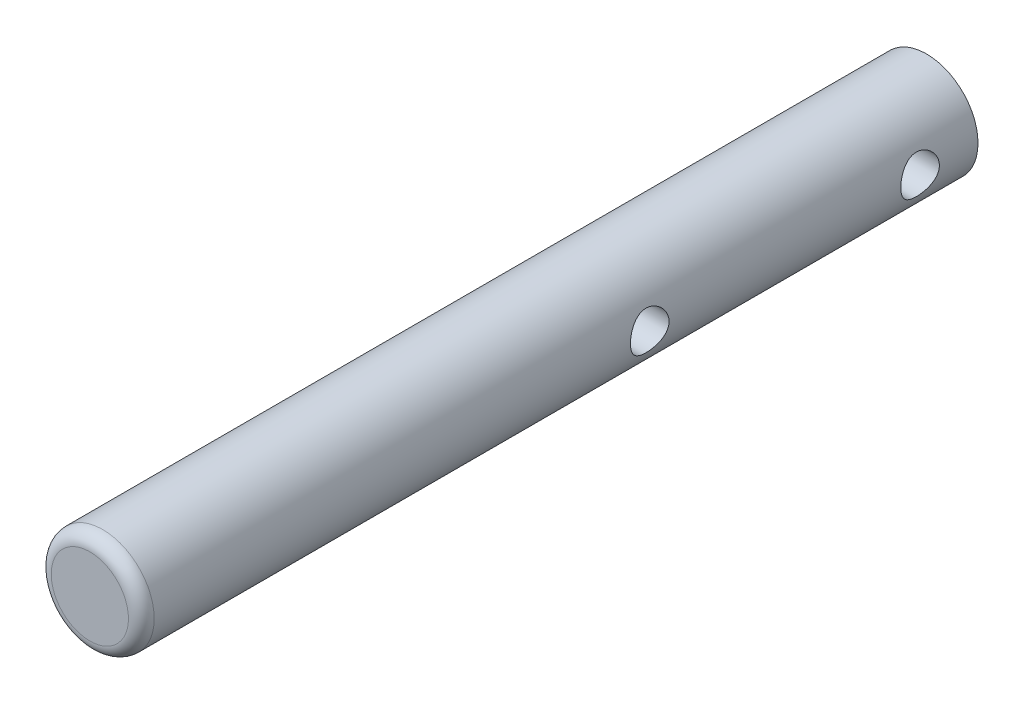
ISO-10303-21;
HEADER;
FILE_DESCRIPTION(('STEP AP214'),'2;1');
FILE_NAME('part.step','',(''),(''),'','','');
FILE_SCHEMA(('AUTOMOTIVE_DESIGN { 1 0 10303 214 1 1 1 1 }'));
ENDSEC;
DATA;
#1=APPLICATION_CONTEXT('core data for automotive mechanical design processes');
#2=APPLICATION_PROTOCOL_DEFINITION('international standard','automotive_design',2000,#1);
#3=PRODUCT_CONTEXT('',#1,'mechanical');
#4=PRODUCT('Part','Part','',(#3));
#5=PRODUCT_RELATED_PRODUCT_CATEGORY('part','',(#4));
#6=PRODUCT_DEFINITION_FORMATION('','',#4);
#7=PRODUCT_DEFINITION_CONTEXT('part definition',#1,'design');
#8=PRODUCT_DEFINITION('design','',#6,#7);
#9=PRODUCT_DEFINITION_SHAPE('','',#8);
#10=(LENGTH_UNIT() NAMED_UNIT(*) SI_UNIT(.MILLI.,.METRE.));
#11=(NAMED_UNIT(*) PLANE_ANGLE_UNIT() SI_UNIT($,.RADIAN.));
#12=(NAMED_UNIT(*) SI_UNIT($,.STERADIAN.) SOLID_ANGLE_UNIT());
#13=UNCERTAINTY_MEASURE_WITH_UNIT(LENGTH_MEASURE(1.E-05),#10,'distance_accuracy_value','');
#14=(GEOMETRIC_REPRESENTATION_CONTEXT(3) GLOBAL_UNCERTAINTY_ASSIGNED_CONTEXT((#13)) GLOBAL_UNIT_ASSIGNED_CONTEXT((#10,
#11,#12)) REPRESENTATION_CONTEXT('',''));
#15=CARTESIAN_POINT('',(0.,0.,0.));
#16=DIRECTION('',(0.,0.,1.));
#17=DIRECTION('',(1.,0.,0.));
#18=AXIS2_PLACEMENT_3D('',#15,#16,#17);
#19=CARTESIAN_POINT('',(0.,0.,65.));
#20=DIRECTION('',(0.,0.,-1.));
#21=DIRECTION('',(-1.,0.,0.));
#22=AXIS2_PLACEMENT_3D('',#19,#20,#21);
#23=CYLINDRICAL_SURFACE('',#22,4.);
#24=CARTESIAN_POINT('',(0.,0.,64.));
#25=DIRECTION('',(0.,0.,1.));
#26=DIRECTION('',(1.,0.,0.));
#27=AXIS2_PLACEMENT_3D('',#24,#25,#26);
#28=CIRCLE('',#27,4.);
#29=CARTESIAN_POINT('',(4.,0.,64.));
#30=VERTEX_POINT('',#29);
#31=EDGE_CURVE('E10',#30,#30,#28,.F.);
#32=ORIENTED_EDGE('',*,*,#31,.T.);
#33=EDGE_LOOP('',(#32));
#34=FACE_BOUND('',#33,.T.);
#35=CARTESIAN_POINT('',(-4.,0.,6.));
#36=CARTESIAN_POINT('',(-4.00000217456151,-0.0812350589378527,6.00000290230312));
#37=CARTESIAN_POINT('',(-3.99750379283184,-0.162450241781792,5.99338023975162));
#38=CARTESIAN_POINT('',(-3.98778696006928,-0.322453452352361,5.96717180473007));
#39=CARTESIAN_POINT('',(-3.98056918893993,-0.401241827987616,5.94758789952943));
#40=CARTESIAN_POINT('',(-3.96218832391545,-0.554060784990879,5.89624699822824));
#41=CARTESIAN_POINT('',(-3.9510328434944,-0.628100224162278,5.86451348317821));
#42=CARTESIAN_POINT('',(-3.92588767765353,-0.769799310160254,5.78989358698418));
#43=CARTESIAN_POINT('',(-3.91189723227548,-0.83745723917788,5.74700421445584));
#44=CARTESIAN_POINT('',(-3.88186246971217,-0.967346417045826,5.64938746892909));
#45=CARTESIAN_POINT('',(-3.86576002583566,-1.02927073015119,5.5942697377406));
#46=CARTESIAN_POINT('',(-3.83360220871327,-1.14324421474363,5.47458956534116));
#47=CARTESIAN_POINT('',(-3.81754685135033,-1.19529036359203,5.41002424391213));
#48=CARTESIAN_POINT('',(-3.78662470617731,-1.28998202215985,5.27028253247679));
#49=CARTESIAN_POINT('',(-3.77182648820818,-1.3321939319576,5.19479563345418));
#50=CARTESIAN_POINT('',(-3.74599860237433,-1.40318646334084,5.03715164583148));
#51=CARTESIAN_POINT('',(-3.73496742975881,-1.43197244961239,4.9549972368449));
#52=CARTESIAN_POINT('',(-3.71854412824136,-1.47408431017549,4.7898832597418));
#53=CARTESIAN_POINT('',(-3.71293924350838,-1.48799593218558,4.70709496156456));
#54=CARTESIAN_POINT('',(-3.70738061461215,-1.50179556531648,4.54018384200616));
#55=CARTESIAN_POINT('',(-3.70742453659305,-1.50168936802631,4.45606158612553));
#56=CARTESIAN_POINT('',(-3.71297511632055,-1.48790429610018,4.29423047478704));
#57=CARTESIAN_POINT('',(-3.71815468871122,-1.47503808509003,4.21643909395582));
#58=CARTESIAN_POINT('',(-3.73284938059529,-1.4374416786833,4.06421284959468));
#59=CARTESIAN_POINT('',(-3.74236515298863,-1.41270969663258,3.98977849338612));
#60=CARTESIAN_POINT('',(-3.76485702190253,-1.35163748571904,3.84472293227177));
#61=CARTESIAN_POINT('',(-3.77789517988166,-1.31508648737101,3.7742005138787));
#62=CARTESIAN_POINT('',(-3.80594210139319,-1.23156073762698,3.64005426240903));
#63=CARTESIAN_POINT('',(-3.82095154457158,-1.18458238728897,3.5764328224803));
#64=CARTESIAN_POINT('',(-3.85248038859113,-1.07781780766549,3.45339633634912));
#65=CARTESIAN_POINT('',(-3.86903347455671,-1.01738298716955,3.39455135925191));
#66=CARTESIAN_POINT('',(-3.90091728164085,-0.88731259081902,3.2876620337942));
#67=CARTESIAN_POINT('',(-3.91624781465952,-0.817675603497363,3.23961934539433));
#68=CARTESIAN_POINT('',(-3.9442639480908,-0.669723436992419,3.15506960293748));
#69=CARTESIAN_POINT('',(-3.95690498259616,-0.591290713844718,3.11875241877894));
#70=CARTESIAN_POINT('',(-3.97778718326962,-0.428836850524582,3.06001739572996));
#71=CARTESIAN_POINT('',(-3.98603030341493,-0.344818210845767,3.03759338343888));
#72=CARTESIAN_POINT('',(-3.99684443228065,-0.178375243148665,3.00837721245806));
#73=CARTESIAN_POINT('',(-3.99969369025686,-0.096103619562209,3.00081739361749));
#74=CARTESIAN_POINT('',(-4.00025893700126,0.0685724752550247,2.99930893610008));
#75=CARTESIAN_POINT('',(-3.99797606386863,0.150976912983373,3.00535727968322));
#76=CARTESIAN_POINT('',(-3.98871709772643,0.31026204856186,3.03031004230867));
#77=CARTESIAN_POINT('',(-3.98192470962305,0.387233328007336,3.04871154373709));
#78=CARTESIAN_POINT('',(-3.96451477091717,0.536941754957221,3.09718607254732));
#79=CARTESIAN_POINT('',(-3.9538967228203,0.609678350347535,3.12726061794804));
#80=CARTESIAN_POINT('',(-3.92949624407681,0.751247765110156,3.19918641243948));
#81=CARTESIAN_POINT('',(-3.91563000209348,0.819903083557796,3.24135772922339));
#82=CARTESIAN_POINT('',(-3.88626671564664,0.949392711726626,3.33591810317156));
#83=CARTESIAN_POINT('',(-3.87076907009516,1.01022412027045,3.38831093254515));
#84=CARTESIAN_POINT('',(-3.8387332949099,1.12603079874454,3.50540412212428));
#85=CARTESIAN_POINT('',(-3.82218696503729,1.18046154123569,3.5706421827727));
#86=CARTESIAN_POINT('',(-3.79078815746854,1.27771050031903,3.70965138470766));
#87=CARTESIAN_POINT('',(-3.77593583194399,1.32052767414518,3.7834232913885));
#88=CARTESIAN_POINT('',(-3.74966829822463,1.39337773518998,3.93801598677231));
#89=CARTESIAN_POINT('',(-3.73826760328493,1.42335685446918,4.01886474591044));
#90=CARTESIAN_POINT('',(-3.72054032891005,1.46907883466889,4.18500976368782));
#91=CARTESIAN_POINT('',(-3.71421061057491,1.48483050305535,4.27030323619812));
#92=CARTESIAN_POINT('',(-3.70775894792573,1.50086347097839,4.43701615954112));
#93=CARTESIAN_POINT('',(-3.70726444523341,1.50207331495837,4.51833263171689));
#94=CARTESIAN_POINT('',(-3.71158412745292,1.49136715641593,4.67994531627617));
#95=CARTESIAN_POINT('',(-3.71639780898899,1.47945239850124,4.76024162467158));
#96=CARTESIAN_POINT('',(-3.73048141585432,1.44355815630242,4.91504722671655));
#97=CARTESIAN_POINT('',(-3.73961085376663,1.41995798316524,4.98965834624535));
#98=CARTESIAN_POINT('',(-3.76121548297845,1.3616969677992,5.13390550849442));
#99=CARTESIAN_POINT('',(-3.77369151995215,1.32703332944945,5.20354028807014));
#100=CARTESIAN_POINT('',(-3.80139723903965,1.24552075938154,5.33982678969763));
#101=CARTESIAN_POINT('',(-3.81673698440964,1.1981283280301,5.40613079679991));
#102=CARTESIAN_POINT('',(-3.84806246757177,1.09334485729906,5.53014156097121));
#103=CARTESIAN_POINT('',(-3.86404840943145,1.03595064012808,5.58784557478675));
#104=CARTESIAN_POINT('',(-3.89590424609881,0.909080396784622,5.69620195582184));
#105=CARTESIAN_POINT('',(-3.91172104900645,0.839118644212991,5.74630375343467));
#106=CARTESIAN_POINT('',(-3.94054514457031,0.69121322320082,5.83402265527656));
#107=CARTESIAN_POINT('',(-3.95355221851559,0.613268934090621,5.87163878773637));
#108=CARTESIAN_POINT('',(-3.9757429260668,0.447999082002311,5.93437682904833));
#109=CARTESIAN_POINT('',(-3.98473657158356,0.360413422234208,5.9588870646019));
#110=CARTESIAN_POINT('',(-3.99686242179587,0.181875733606381,5.99169295992068));
#111=CARTESIAN_POINT('',(-3.99999756603967,0.0909254163648586,5.99999675148733));
#112=CARTESIAN_POINT('',(-4.,0.,6.));
#113=B_SPLINE_CURVE_WITH_KNOTS('',3,(#35,#36,#37,#38,#39,#40,#41,#42,#43,#44,#45,#46,#47,#48,
#49,#50,#51,#52,#53,#54,#55,#56,#57,#58,#59,#60,#61,#62,#63,#64,#65,#66,#67,#68,#69,#70,#71,#72,
#73,#74,#75,#76,#77,#78,#79,#80,#81,#82,#83,#84,#85,#86,#87,#88,#89,#90,#91,#92,#93,#94,#95,#96,
#97,#98,#99,#100,#101,#102,#103,#104,#105,#106,#107,#108,#109,#110,#111,#112),.UNSPECIFIED.,.T.,
.F.,(4,2,2,2,2,2,2,2,2,2,2,2,2,2,2,2,2,2,2,2,2,2,2,2,2,2,2,2,2,2,2,2,2,2,2,2,2,2,4),(0.,
0.24336980156056,0.486704549530461,0.729571369213574,0.97250337960949,1.22473618582715,
1.47704604925622,1.73896674501659,2.00078269352134,2.25185874416902,2.50283106079707,
2.73878345119971,2.97477138060589,3.21522408387018,3.45575990744259,3.71246153335813,
3.96920257905066,4.22991375286075,4.49050899698846,4.73725019635925,4.98393668390521,
5.2211443792384,5.45838293254454,5.702592218596,5.94689180019868,6.20536519455658,
6.46386178920141,6.72343066727204,6.98283874956507,7.22558763480252,7.46831350211259,
7.70363142426533,7.93900886656507,8.18672471884271,8.43451941997062,8.69572329654039,
8.95694749805102,9.22948515032042,9.50188601796127),.UNSPECIFIED.);
#114=CARTESIAN_POINT('',(-4.,0.,6.));
#115=VERTEX_POINT('',#114);
#116=EDGE_CURVE('E49',#115,#115,#113,.T.);
#117=ORIENTED_EDGE('',*,*,#116,.T.);
#118=EDGE_LOOP('',(#117));
#119=FACE_BOUND('',#118,.T.);
#120=CARTESIAN_POINT('',(4.,0.,3.));
#121=CARTESIAN_POINT('',(4.00000217456151,-0.0812350589378529,2.99999709769689));
#122=CARTESIAN_POINT('',(3.99750379283184,-0.162450241781792,3.00661976024838));
#123=CARTESIAN_POINT('',(3.98778696006928,-0.322453452352361,3.03282819526993));
#124=CARTESIAN_POINT('',(3.98056918893993,-0.401241827987616,3.05241210047057));
#125=CARTESIAN_POINT('',(3.96218832391545,-0.554060784990879,3.10375300177176));
#126=CARTESIAN_POINT('',(3.9510328434944,-0.628100224162278,3.13548651682179));
#127=CARTESIAN_POINT('',(3.92588767765353,-0.769799310160254,3.21010641301582));
#128=CARTESIAN_POINT('',(3.91189723227548,-0.837457239177879,3.25299578554416));
#129=CARTESIAN_POINT('',(3.88186246971217,-0.967346417045826,3.35061253107091));
#130=CARTESIAN_POINT('',(3.86576002583566,-1.02927073015119,3.4057302622594));
#131=CARTESIAN_POINT('',(3.83360220871327,-1.14324421474363,3.52541043465884));
#132=CARTESIAN_POINT('',(3.81754685135033,-1.19529036359203,3.58997575608788));
#133=CARTESIAN_POINT('',(3.78662470617731,-1.28998202215985,3.72971746752321));
#134=CARTESIAN_POINT('',(3.77182648820818,-1.3321939319576,3.80520436654582));
#135=CARTESIAN_POINT('',(3.74599860237433,-1.40318646334084,3.96284835416852));
#136=CARTESIAN_POINT('',(3.73496742975881,-1.43197244961239,4.0450027631551));
#137=CARTESIAN_POINT('',(3.71854412824136,-1.47408431017549,4.2101167402582));
#138=CARTESIAN_POINT('',(3.71293924350838,-1.48799593218558,4.29290503843544));
#139=CARTESIAN_POINT('',(3.70738061461215,-1.50179556531648,4.45981615799384));
#140=CARTESIAN_POINT('',(3.70742453659305,-1.5016893680263,4.54393841387447));
#141=CARTESIAN_POINT('',(3.71297511632055,-1.48790429610018,4.70576952521296));
#142=CARTESIAN_POINT('',(3.71815468871122,-1.47503808509003,4.78356090604418));
#143=CARTESIAN_POINT('',(3.73284938059529,-1.4374416786833,4.93578715040532));
#144=CARTESIAN_POINT('',(3.74236515298863,-1.41270969663258,5.01022150661388));
#145=CARTESIAN_POINT('',(3.76485702190253,-1.35163748571904,5.15527706772823));
#146=CARTESIAN_POINT('',(3.77789517988166,-1.31508648737101,5.2257994861213));
#147=CARTESIAN_POINT('',(3.80594210139319,-1.23156073762698,5.35994573759097));
#148=CARTESIAN_POINT('',(3.82095154457158,-1.18458238728897,5.4235671775197));
#149=CARTESIAN_POINT('',(3.85248038859113,-1.07781780766549,5.54660366365088));
#150=CARTESIAN_POINT('',(3.86903347455671,-1.01738298716955,5.60544864074809));
#151=CARTESIAN_POINT('',(3.90091728164085,-0.88731259081902,5.7123379662058));
#152=CARTESIAN_POINT('',(3.91624781465952,-0.817675603497363,5.76038065460567));
#153=CARTESIAN_POINT('',(3.9442639480908,-0.669723436992419,5.84493039706252));
#154=CARTESIAN_POINT('',(3.95690498259616,-0.591290713844718,5.88124758122106));
#155=CARTESIAN_POINT('',(3.97778718326962,-0.428836850524583,5.93998260427004));
#156=CARTESIAN_POINT('',(3.98603030341493,-0.344818210845767,5.96240661656112));
#157=CARTESIAN_POINT('',(3.99684443228065,-0.178375243148665,5.99162278754194));
#158=CARTESIAN_POINT('',(3.99969369025686,-0.0961036195622095,5.99918260638251));
#159=CARTESIAN_POINT('',(4.00025893700126,0.0685724752550242,6.00069106389992));
#160=CARTESIAN_POINT('',(3.99797606386863,0.150976912983373,5.99464272031678));
#161=CARTESIAN_POINT('',(3.98871709772643,0.310262048561859,5.96968995769133));
#162=CARTESIAN_POINT('',(3.98192470962305,0.387233328007336,5.95128845626292));
#163=CARTESIAN_POINT('',(3.96451477091717,0.536941754957221,5.90281392745268));
#164=CARTESIAN_POINT('',(3.9538967228203,0.609678350347534,5.87273938205196));
#165=CARTESIAN_POINT('',(3.92949624407681,0.751247765110155,5.80081358756052));
#166=CARTESIAN_POINT('',(3.91563000209348,0.819903083557795,5.75864227077661));
#167=CARTESIAN_POINT('',(3.88626671564664,0.949392711726625,5.66408189682844));
#168=CARTESIAN_POINT('',(3.87076907009516,1.01022412027045,5.61168906745485));
#169=CARTESIAN_POINT('',(3.8387332949099,1.12603079874454,5.49459587787573));
#170=CARTESIAN_POINT('',(3.82218696503729,1.18046154123568,5.4293578172273));
#171=CARTESIAN_POINT('',(3.79078815746854,1.27771050031903,5.29034861529234));
#172=CARTESIAN_POINT('',(3.77593583194399,1.32052767414518,5.2165767086115));
#173=CARTESIAN_POINT('',(3.74966829822463,1.39337773518998,5.06198401322769));
#174=CARTESIAN_POINT('',(3.73826760328493,1.42335685446918,4.98113525408956));
#175=CARTESIAN_POINT('',(3.72054032891005,1.46907883466889,4.81499023631218));
#176=CARTESIAN_POINT('',(3.71421061057491,1.48483050305535,4.72969676380188));
#177=CARTESIAN_POINT('',(3.70775894792573,1.50086347097839,4.56298384045889));
#178=CARTESIAN_POINT('',(3.70726444523341,1.50207331495837,4.48166736828311));
#179=CARTESIAN_POINT('',(3.71158412745292,1.49136715641593,4.32005468372384));
#180=CARTESIAN_POINT('',(3.71639780898899,1.47945239850124,4.23975837532842));
#181=CARTESIAN_POINT('',(3.73048141585432,1.44355815630242,4.08495277328345));
#182=CARTESIAN_POINT('',(3.73961085376663,1.41995798316524,4.01034165375466));
#183=CARTESIAN_POINT('',(3.76121548297845,1.3616969677992,3.86609449150558));
#184=CARTESIAN_POINT('',(3.77369151995215,1.32703332944945,3.79645971192986));
#185=CARTESIAN_POINT('',(3.80139723903965,1.24552075938154,3.66017321030237));
#186=CARTESIAN_POINT('',(3.81673698440964,1.1981283280301,3.59386920320009));
#187=CARTESIAN_POINT('',(3.84806246757177,1.09334485729906,3.4698584390288));
#188=CARTESIAN_POINT('',(3.86404840943145,1.03595064012808,3.41215442521325));
#189=CARTESIAN_POINT('',(3.89590424609881,0.909080396784623,3.30379804417816));
#190=CARTESIAN_POINT('',(3.91172104900645,0.839118644212992,3.25369624656533));
#191=CARTESIAN_POINT('',(3.94054514457031,0.691213223200821,3.16597734472344));
#192=CARTESIAN_POINT('',(3.95355221851559,0.613268934090621,3.12836121226363));
#193=CARTESIAN_POINT('',(3.9757429260668,0.447999082002312,3.06562317095167));
#194=CARTESIAN_POINT('',(3.98473657158356,0.360413422234208,3.0411129353981));
#195=CARTESIAN_POINT('',(3.99686242179587,0.181875733606382,3.00830704007932));
#196=CARTESIAN_POINT('',(3.99999756603967,0.0909254163648589,3.00000324851268));
#197=CARTESIAN_POINT('',(4.,0.,3.));
#198=B_SPLINE_CURVE_WITH_KNOTS('',3,(#120,#121,#122,#123,#124,#125,#126,#127,#128,#129,#130,
#131,#132,#133,#134,#135,#136,#137,#138,#139,#140,#141,#142,#143,#144,#145,#146,#147,#148,#149,
#150,#151,#152,#153,#154,#155,#156,#157,#158,#159,#160,#161,#162,#163,#164,#165,#166,#167,#168,
#169,#170,#171,#172,#173,#174,#175,#176,#177,#178,#179,#180,#181,#182,#183,#184,#185,#186,#187,
#188,#189,#190,#191,#192,#193,#194,#195,#196,#197),.UNSPECIFIED.,.T.,.F.,(4,2,2,2,2,2,2,2,2,2,2,
2,2,2,2,2,2,2,2,2,2,2,2,2,2,2,2,2,2,2,2,2,2,2,2,2,2,2,4),(0.,0.24336980156056,0.486704549530461,
0.729571369213573,0.97250337960949,1.22473618582715,1.47704604925622,1.73896674501659,
2.00078269352134,2.25185874416902,2.50283106079707,2.73878345119971,2.97477138060589,
3.21522408387018,3.45575990744258,3.71246153335813,3.96920257905066,4.22991375286075,
4.49050899698846,4.73725019635925,4.98393668390521,5.2211443792384,5.45838293254453,
5.702592218596,5.94689180019868,6.20536519455658,6.46386178920141,6.72343066727204,
6.98283874956507,7.22558763480252,7.46831350211259,7.70363142426533,7.93900886656506,
8.18672471884271,8.43451941997062,8.69572329654039,8.95694749805102,9.22948515032042,
9.50188601796128),.UNSPECIFIED.);
#199=CARTESIAN_POINT('',(4.,0.,3.));
#200=VERTEX_POINT('',#199);
#201=EDGE_CURVE('E56',#200,#200,#198,.T.);
#202=ORIENTED_EDGE('',*,*,#201,.T.);
#203=EDGE_LOOP('',(#202));
#204=FACE_BOUND('',#203,.T.);
#205=CARTESIAN_POINT('',(-4.,0.,27.));
#206=CARTESIAN_POINT('',(-4.00000217456151,-0.0812350589378528,27.0000029023031));
#207=CARTESIAN_POINT('',(-3.99750379283184,-0.162450241781792,26.9933802397516));
#208=CARTESIAN_POINT('',(-3.98778696006928,-0.322453452352361,26.9671718047301));
#209=CARTESIAN_POINT('',(-3.98056918893993,-0.401241827987616,26.9475878995294));
#210=CARTESIAN_POINT('',(-3.96218832391545,-0.554060784990879,26.8962469982282));
#211=CARTESIAN_POINT('',(-3.9510328434944,-0.628100224162278,26.8645134831782));
#212=CARTESIAN_POINT('',(-3.92588767765353,-0.769799310160255,26.7898935869842));
#213=CARTESIAN_POINT('',(-3.91189723227548,-0.83745723917788,26.7470042144558));
#214=CARTESIAN_POINT('',(-3.88186246971217,-0.967346417045826,26.6493874689291));
#215=CARTESIAN_POINT('',(-3.86576002583566,-1.02927073015119,26.5942697377406));
#216=CARTESIAN_POINT('',(-3.83360220871327,-1.14324421474363,26.4745895653412));
#217=CARTESIAN_POINT('',(-3.81754685135033,-1.19529036359203,26.4100242439121));
#218=CARTESIAN_POINT('',(-3.78662470617731,-1.28998202215985,26.2702825324768));
#219=CARTESIAN_POINT('',(-3.77182648820818,-1.3321939319576,26.1947956334542));
#220=CARTESIAN_POINT('',(-3.74599860237433,-1.40318646334085,26.0371516458315));
#221=CARTESIAN_POINT('',(-3.73496742975881,-1.43197244961239,25.9549972368449));
#222=CARTESIAN_POINT('',(-3.71854412824136,-1.47408431017549,25.7898832597418));
#223=CARTESIAN_POINT('',(-3.71293924350838,-1.48799593218558,25.7070949615646));
#224=CARTESIAN_POINT('',(-3.70738061461215,-1.50179556531648,25.5401838420062));
#225=CARTESIAN_POINT('',(-3.70742453659305,-1.50168936802631,25.4560615861255));
#226=CARTESIAN_POINT('',(-3.71297511632055,-1.48790429610018,25.294230474787));
#227=CARTESIAN_POINT('',(-3.71815468871121,-1.47503808509003,25.2164390939558));
#228=CARTESIAN_POINT('',(-3.73284938059529,-1.4374416786833,25.0642128495947));
#229=CARTESIAN_POINT('',(-3.74236515298863,-1.41270969663258,24.9897784933861));
#230=CARTESIAN_POINT('',(-3.76485702190253,-1.35163748571904,24.8447229322718));
#231=CARTESIAN_POINT('',(-3.77789517988166,-1.31508648737101,24.7742005138787));
#232=CARTESIAN_POINT('',(-3.80594210139319,-1.23156073762698,24.640054262409));
#233=CARTESIAN_POINT('',(-3.82095154457158,-1.18458238728897,24.5764328224803));
#234=CARTESIAN_POINT('',(-3.85248038859113,-1.07781780766549,24.4533963363491));
#235=CARTESIAN_POINT('',(-3.86903347455671,-1.01738298716956,24.3945513592519));
#236=CARTESIAN_POINT('',(-3.90091728164085,-0.887312590819022,24.2876620337942));
#237=CARTESIAN_POINT('',(-3.91624781465952,-0.817675603497365,24.2396193453943));
#238=CARTESIAN_POINT('',(-3.9442639480908,-0.66972343699242,24.1550696029375));
#239=CARTESIAN_POINT('',(-3.95690498259616,-0.591290713844719,24.1187524187789));
#240=CARTESIAN_POINT('',(-3.97778718326962,-0.428836850524583,24.06001739573));
#241=CARTESIAN_POINT('',(-3.98603030341493,-0.344818210845767,24.0375933834389));
#242=CARTESIAN_POINT('',(-3.99684443228065,-0.178375243148666,24.0083772124581));
#243=CARTESIAN_POINT('',(-3.99969369025686,-0.0961036195622097,24.0008173936175));
#244=CARTESIAN_POINT('',(-4.00025893700126,0.0685724752550241,23.9993089361001));
#245=CARTESIAN_POINT('',(-3.99797606386863,0.150976912983373,24.0053572796832));
#246=CARTESIAN_POINT('',(-3.98871709772643,0.310262048561859,24.0303100423087));
#247=CARTESIAN_POINT('',(-3.98192470962305,0.387233328007336,24.0487115437371));
#248=CARTESIAN_POINT('',(-3.96451477091717,0.53694175495722,24.0971860725473));
#249=CARTESIAN_POINT('',(-3.9538967228203,0.609678350347534,24.127260617948));
#250=CARTESIAN_POINT('',(-3.92949624407681,0.751247765110155,24.1991864124395));
#251=CARTESIAN_POINT('',(-3.91563000209348,0.819903083557796,24.2413577292234));
#252=CARTESIAN_POINT('',(-3.88626671564664,0.949392711726626,24.3359181031716));
#253=CARTESIAN_POINT('',(-3.87076907009516,1.01022412027045,24.3883109325452));
#254=CARTESIAN_POINT('',(-3.83873329490989,1.12603079874454,24.5054041221243));
#255=CARTESIAN_POINT('',(-3.82218696503729,1.18046154123569,24.5706421827727));
#256=CARTESIAN_POINT('',(-3.79078815746853,1.27771050031904,24.7096513847077));
#257=CARTESIAN_POINT('',(-3.77593583194399,1.32052767414519,24.7834232913885));
#258=CARTESIAN_POINT('',(-3.74966829822463,1.39337773518998,24.9380159867723));
#259=CARTESIAN_POINT('',(-3.73826760328493,1.42335685446918,25.0188647459104));
#260=CARTESIAN_POINT('',(-3.72054032891005,1.46907883466889,25.1850097636878));
#261=CARTESIAN_POINT('',(-3.71421061057491,1.48483050305535,25.2703032361981));
#262=CARTESIAN_POINT('',(-3.70775894792573,1.50086347097839,25.4370161595411));
#263=CARTESIAN_POINT('',(-3.70726444523341,1.50207331495837,25.5183326317169));
#264=CARTESIAN_POINT('',(-3.71158412745292,1.49136715641593,25.6799453162762));
#265=CARTESIAN_POINT('',(-3.71639780898899,1.47945239850124,25.7602416246716));
#266=CARTESIAN_POINT('',(-3.73048141585432,1.44355815630242,25.9150472267166));
#267=CARTESIAN_POINT('',(-3.73961085376663,1.41995798316524,25.9896583462453));
#268=CARTESIAN_POINT('',(-3.76121548297845,1.3616969677992,26.1339055084944));
#269=CARTESIAN_POINT('',(-3.77369151995215,1.32703332944945,26.2035402880701));
#270=CARTESIAN_POINT('',(-3.80139723903965,1.24552075938154,26.3398267896976));
#271=CARTESIAN_POINT('',(-3.81673698440964,1.1981283280301,26.4061307967999));
#272=CARTESIAN_POINT('',(-3.84806246757177,1.09334485729906,26.5301415609712));
#273=CARTESIAN_POINT('',(-3.86404840943145,1.03595064012808,26.5878455747868));
#274=CARTESIAN_POINT('',(-3.89590424609881,0.909080396784624,26.6962019558218));
#275=CARTESIAN_POINT('',(-3.91172104900645,0.839118644212993,26.7463037534347));
#276=CARTESIAN_POINT('',(-3.9405451445703,0.691213223200822,26.8340226552766));
#277=CARTESIAN_POINT('',(-3.95355221851559,0.613268934090623,26.8716387877364));
#278=CARTESIAN_POINT('',(-3.9757429260668,0.447999082002313,26.9343768290483));
#279=CARTESIAN_POINT('',(-3.98473657158356,0.360413422234208,26.9588870646019));
#280=CARTESIAN_POINT('',(-3.99686242179587,0.181875733606382,26.9916929599207));
#281=CARTESIAN_POINT('',(-3.99999756603967,0.0909254163648587,26.9999967514873));
#282=CARTESIAN_POINT('',(-4.,0.,27.));
#283=B_SPLINE_CURVE_WITH_KNOTS('',3,(#205,#206,#207,#208,#209,#210,#211,#212,#213,#214,#215,
#216,#217,#218,#219,#220,#221,#222,#223,#224,#225,#226,#227,#228,#229,#230,#231,#232,#233,#234,
#235,#236,#237,#238,#239,#240,#241,#242,#243,#244,#245,#246,#247,#248,#249,#250,#251,#252,#253,
#254,#255,#256,#257,#258,#259,#260,#261,#262,#263,#264,#265,#266,#267,#268,#269,#270,#271,#272,
#273,#274,#275,#276,#277,#278,#279,#280,#281,#282),.UNSPECIFIED.,.T.,.F.,(4,2,2,2,2,2,2,2,2,2,2,
2,2,2,2,2,2,2,2,2,2,2,2,2,2,2,2,2,2,2,2,2,2,2,2,2,2,2,4),(0.,0.24336980156056,0.48670454953046,
0.729571369213573,0.972503379609492,1.22473618582716,1.47704604925622,1.73896674501659,
2.00078269352134,2.25185874416902,2.50283106079707,2.73878345119972,2.97477138060589,
3.21522408387018,3.45575990744259,3.71246153335813,3.96920257905066,4.22991375286075,
4.49050899698846,4.73725019635926,4.98393668390521,5.2211443792384,5.45838293254454,
5.702592218596,5.94689180019868,6.20536519455659,6.46386178920141,6.72343066727205,
6.98283874956507,7.22558763480252,7.46831350211259,7.70363142426534,7.93900886656507,
8.18672471884271,8.43451941997062,8.69572329654039,8.95694749805102,9.22948515032042,
9.50188601796128),.UNSPECIFIED.);
#284=CARTESIAN_POINT('',(-4.,0.,27.));
#285=VERTEX_POINT('',#284);
#286=EDGE_CURVE('E46',#285,#285,#283,.T.);
#287=ORIENTED_EDGE('',*,*,#286,.T.);
#288=EDGE_LOOP('',(#287));
#289=FACE_BOUND('',#288,.T.);
#290=CARTESIAN_POINT('',(4.,0.,24.));
#291=CARTESIAN_POINT('',(4.00000217456151,-0.0812350589378528,23.9999970976969));
#292=CARTESIAN_POINT('',(3.99750379283184,-0.162450241781792,24.0066197602484));
#293=CARTESIAN_POINT('',(3.98778696006928,-0.322453452352361,24.0328281952699));
#294=CARTESIAN_POINT('',(3.98056918893993,-0.401241827987616,24.0524121004706));
#295=CARTESIAN_POINT('',(3.96218832391545,-0.554060784990879,24.1037530017718));
#296=CARTESIAN_POINT('',(3.9510328434944,-0.628100224162278,24.1354865168218));
#297=CARTESIAN_POINT('',(3.92588767765353,-0.769799310160255,24.2101064130158));
#298=CARTESIAN_POINT('',(3.91189723227548,-0.83745723917788,24.2529957855442));
#299=CARTESIAN_POINT('',(3.88186246971217,-0.967346417045826,24.3506125310709));
#300=CARTESIAN_POINT('',(3.86576002583566,-1.02927073015119,24.4057302622594));
#301=CARTESIAN_POINT('',(3.83360220871327,-1.14324421474363,24.5254104346588));
#302=CARTESIAN_POINT('',(3.81754685135033,-1.19529036359203,24.5899757560879));
#303=CARTESIAN_POINT('',(3.78662470617731,-1.28998202215985,24.7297174675232));
#304=CARTESIAN_POINT('',(3.77182648820818,-1.3321939319576,24.8052043665458));
#305=CARTESIAN_POINT('',(3.74599860237433,-1.40318646334084,24.9628483541685));
#306=CARTESIAN_POINT('',(3.73496742975881,-1.43197244961239,25.0450027631551));
#307=CARTESIAN_POINT('',(3.71854412824136,-1.47408431017549,25.2101167402582));
#308=CARTESIAN_POINT('',(3.71293924350838,-1.48799593218558,25.2929050384354));
#309=CARTESIAN_POINT('',(3.70738061461215,-1.50179556531648,25.4598161579938));
#310=CARTESIAN_POINT('',(3.70742453659305,-1.50168936802631,25.5439384138745));
#311=CARTESIAN_POINT('',(3.71297511632055,-1.48790429610018,25.705769525213));
#312=CARTESIAN_POINT('',(3.71815468871121,-1.47503808509003,25.7835609060442));
#313=CARTESIAN_POINT('',(3.73284938059529,-1.4374416786833,25.9357871504053));
#314=CARTESIAN_POINT('',(3.74236515298863,-1.41270969663258,26.0102215066139));
#315=CARTESIAN_POINT('',(3.76485702190253,-1.35163748571904,26.1552770677282));
#316=CARTESIAN_POINT('',(3.77789517988166,-1.31508648737101,26.2257994861213));
#317=CARTESIAN_POINT('',(3.80594210139319,-1.23156073762698,26.359945737591));
#318=CARTESIAN_POINT('',(3.82095154457158,-1.18458238728897,26.4235671775197));
#319=CARTESIAN_POINT('',(3.85248038859113,-1.07781780766549,26.5466036636509));
#320=CARTESIAN_POINT('',(3.86903347455671,-1.01738298716956,26.6054486407481));
#321=CARTESIAN_POINT('',(3.90091728164085,-0.887312590819021,26.7123379662058));
#322=CARTESIAN_POINT('',(3.91624781465952,-0.817675603497364,26.7603806546057));
#323=CARTESIAN_POINT('',(3.9442639480908,-0.66972343699242,26.8449303970625));
#324=CARTESIAN_POINT('',(3.95690498259616,-0.59129071384472,26.8812475812211));
#325=CARTESIAN_POINT('',(3.97778718326962,-0.428836850524584,26.93998260427));
#326=CARTESIAN_POINT('',(3.98603030341493,-0.344818210845768,26.9624066165611));
#327=CARTESIAN_POINT('',(3.99684443228065,-0.178375243148666,26.9916227875419));
#328=CARTESIAN_POINT('',(3.99969369025686,-0.0961036195622097,26.9991826063825));
#329=CARTESIAN_POINT('',(4.00025893700126,0.0685724752550241,27.0006910638999));
#330=CARTESIAN_POINT('',(3.99797606386863,0.150976912983373,26.9946427203168));
#331=CARTESIAN_POINT('',(3.98871709772643,0.31026204856186,26.9696899576913));
#332=CARTESIAN_POINT('',(3.98192470962305,0.387233328007336,26.9512884562629));
#333=CARTESIAN_POINT('',(3.96451477091717,0.536941754957221,26.9028139274527));
#334=CARTESIAN_POINT('',(3.9538967228203,0.609678350347534,26.872739382052));
#335=CARTESIAN_POINT('',(3.92949624407681,0.751247765110155,26.8008135875605));
#336=CARTESIAN_POINT('',(3.91563000209348,0.819903083557796,26.7586422707766));
#337=CARTESIAN_POINT('',(3.88626671564664,0.949392711726626,26.6640818968284));
#338=CARTESIAN_POINT('',(3.87076907009516,1.01022412027045,26.6116890674548));
#339=CARTESIAN_POINT('',(3.83873329490989,1.12603079874454,26.4945958778757));
#340=CARTESIAN_POINT('',(3.82218696503729,1.18046154123569,26.4293578172273));
#341=CARTESIAN_POINT('',(3.79078815746854,1.27771050031903,26.2903486152923));
#342=CARTESIAN_POINT('',(3.77593583194399,1.32052767414519,26.2165767086115));
#343=CARTESIAN_POINT('',(3.74966829822463,1.39337773518998,26.0619840132277));
#344=CARTESIAN_POINT('',(3.73826760328493,1.42335685446918,25.9811352540896));
#345=CARTESIAN_POINT('',(3.72054032891005,1.46907883466889,25.8149902363122));
#346=CARTESIAN_POINT('',(3.71421061057491,1.48483050305535,25.7296967638019));
#347=CARTESIAN_POINT('',(3.70775894792573,1.50086347097839,25.5629838404589));
#348=CARTESIAN_POINT('',(3.70726444523341,1.50207331495837,25.4816673682831));
#349=CARTESIAN_POINT('',(3.71158412745292,1.49136715641593,25.3200546837238));
#350=CARTESIAN_POINT('',(3.71639780898899,1.47945239850124,25.2397583753284));
#351=CARTESIAN_POINT('',(3.73048141585432,1.44355815630242,25.0849527732834));
#352=CARTESIAN_POINT('',(3.73961085376663,1.41995798316524,25.0103416537547));
#353=CARTESIAN_POINT('',(3.76121548297845,1.3616969677992,24.8660944915056));
#354=CARTESIAN_POINT('',(3.77369151995215,1.32703332944945,24.7964597119299));
#355=CARTESIAN_POINT('',(3.80139723903965,1.24552075938154,24.6601732103024));
#356=CARTESIAN_POINT('',(3.81673698440964,1.1981283280301,24.5938692032001));
#357=CARTESIAN_POINT('',(3.84806246757177,1.09334485729906,24.4698584390288));
#358=CARTESIAN_POINT('',(3.86404840943145,1.03595064012808,24.4121544252132));
#359=CARTESIAN_POINT('',(3.89590424609881,0.909080396784624,24.3037980441782));
#360=CARTESIAN_POINT('',(3.91172104900645,0.839118644212993,24.2536962465653));
#361=CARTESIAN_POINT('',(3.9405451445703,0.691213223200822,24.1659773447234));
#362=CARTESIAN_POINT('',(3.95355221851559,0.613268934090623,24.1283612122636));
#363=CARTESIAN_POINT('',(3.9757429260668,0.447999082002313,24.0656231709517));
#364=CARTESIAN_POINT('',(3.98473657158356,0.360413422234208,24.0411129353981));
#365=CARTESIAN_POINT('',(3.99686242179587,0.181875733606382,24.0083070400793));
#366=CARTESIAN_POINT('',(3.99999756603967,0.0909254163648587,24.0000032485127));
#367=CARTESIAN_POINT('',(4.,0.,24.));
#368=B_SPLINE_CURVE_WITH_KNOTS('',3,(#290,#291,#292,#293,#294,#295,#296,#297,#298,#299,#300,
#301,#302,#303,#304,#305,#306,#307,#308,#309,#310,#311,#312,#313,#314,#315,#316,#317,#318,#319,
#320,#321,#322,#323,#324,#325,#326,#327,#328,#329,#330,#331,#332,#333,#334,#335,#336,#337,#338,
#339,#340,#341,#342,#343,#344,#345,#346,#347,#348,#349,#350,#351,#352,#353,#354,#355,#356,#357,
#358,#359,#360,#361,#362,#363,#364,#365,#366,#367),.UNSPECIFIED.,.T.,.F.,(4,2,2,2,2,2,2,2,2,2,2,
2,2,2,2,2,2,2,2,2,2,2,2,2,2,2,2,2,2,2,2,2,2,2,2,2,2,2,4),(0.,0.24336980156056,0.48670454953046,
0.729571369213573,0.972503379609492,1.22473618582716,1.47704604925622,1.73896674501658,
2.00078269352134,2.25185874416901,2.50283106079707,2.73878345119972,2.97477138060589,
3.21522408387018,3.45575990744259,3.71246153335813,3.96920257905066,4.22991375286075,
4.49050899698846,4.73725019635926,4.98393668390521,5.2211443792384,5.45838293254454,
5.702592218596,5.94689180019868,6.20536519455658,6.46386178920142,6.72343066727204,
6.98283874956507,7.22558763480253,7.4683135021126,7.70363142426534,7.93900886656507,
8.18672471884272,8.43451941997063,8.69572329654039,8.95694749805103,9.22948515032043,
9.50188601796128),.UNSPECIFIED.);
#369=CARTESIAN_POINT('',(4.,0.,24.));
#370=VERTEX_POINT('',#369);
#371=EDGE_CURVE('E55',#370,#370,#368,.T.);
#372=ORIENTED_EDGE('',*,*,#371,.T.);
#373=EDGE_LOOP('',(#372));
#374=FACE_BOUND('',#373,.T.);
#375=CARTESIAN_POINT('',(0.,0.,0.));
#376=DIRECTION('',(0.,0.,1.));
#377=DIRECTION('',(1.,0.,0.));
#378=AXIS2_PLACEMENT_3D('',#375,#376,#377);
#379=CIRCLE('',#378,4.);
#380=CARTESIAN_POINT('',(4.,0.,0.));
#381=VERTEX_POINT('',#380);
#382=EDGE_CURVE('E42',#381,#381,#379,.T.);
#383=ORIENTED_EDGE('',*,*,#382,.T.);
#384=EDGE_LOOP('',(#383));
#385=FACE_BOUND('',#384,.T.);
#386=ADVANCED_FACE('F31',(#34,#119,#204,#289,#374,#385),#23,.T.);
#387=CARTESIAN_POINT('',(0.,0.,65.));
#388=DIRECTION('',(0.,0.,1.));
#389=DIRECTION('',(1.,0.,0.));
#390=AXIS2_PLACEMENT_3D('',#387,#388,#389);
#391=PLANE('',#390);
#392=CARTESIAN_POINT('',(0.,0.,65.));
#393=DIRECTION('',(0.,0.,1.));
#394=DIRECTION('',(1.,0.,0.));
#395=AXIS2_PLACEMENT_3D('',#392,#393,#394);
#396=CIRCLE('',#395,3.);
#397=CARTESIAN_POINT('',(3.,0.,65.));
#398=VERTEX_POINT('',#397);
#399=EDGE_CURVE('E38',#398,#398,#396,.T.);
#400=ORIENTED_EDGE('',*,*,#399,.T.);
#401=EDGE_LOOP('',(#400));
#402=FACE_BOUND('',#401,.T.);
#403=ADVANCED_FACE('F74',(#402),#391,.T.);
#404=CARTESIAN_POINT('',(0.,0.,0.));
#405=DIRECTION('',(0.,0.,1.));
#406=DIRECTION('',(1.,0.,0.));
#407=AXIS2_PLACEMENT_3D('',#404,#405,#406);
#408=PLANE('',#407);
#409=ORIENTED_EDGE('',*,*,#382,.F.);
#410=EDGE_LOOP('',(#409));
#411=FACE_BOUND('',#410,.T.);
#412=ADVANCED_FACE('F72',(#411),#408,.F.);
#413=CARTESIAN_POINT('',(-5.,0.,25.5));
#414=DIRECTION('',(1.,0.,0.));
#415=DIRECTION('',(0.,0.,-1.));
#416=AXIS2_PLACEMENT_3D('',#413,#414,#415);
#417=CYLINDRICAL_SURFACE('',#416,1.5);
#418=ORIENTED_EDGE('',*,*,#371,.F.);
#419=EDGE_LOOP('',(#418));
#420=FACE_BOUND('',#419,.T.);
#421=ORIENTED_EDGE('',*,*,#286,.F.);
#422=EDGE_LOOP('',(#421));
#423=FACE_BOUND('',#422,.T.);
#424=ADVANCED_FACE('F66',(#420,#423),#417,.F.);
#425=CARTESIAN_POINT('',(-5.,0.,4.5));
#426=DIRECTION('',(1.,0.,0.));
#427=DIRECTION('',(0.,0.,-1.));
#428=AXIS2_PLACEMENT_3D('',#425,#426,#427);
#429=CYLINDRICAL_SURFACE('',#428,1.5);
#430=ORIENTED_EDGE('',*,*,#201,.F.);
#431=EDGE_LOOP('',(#430));
#432=FACE_BOUND('',#431,.T.);
#433=ORIENTED_EDGE('',*,*,#116,.F.);
#434=EDGE_LOOP('',(#433));
#435=FACE_BOUND('',#434,.T.);
#436=ADVANCED_FACE('F62',(#432,#435),#429,.F.);
#437=CARTESIAN_POINT('',(0.,0.,64.));
#438=DIRECTION('',(0.,0.,1.));
#439=DIRECTION('',(1.,0.,0.));
#440=AXIS2_PLACEMENT_3D('',#437,#438,#439);
#441=TOROIDAL_SURFACE('',#440,3.,1.);
#442=ORIENTED_EDGE('',*,*,#31,.F.);
#443=EDGE_LOOP('',(#442));
#444=FACE_BOUND('',#443,.T.);
#445=ORIENTED_EDGE('',*,*,#399,.F.);
#446=EDGE_LOOP('',(#445));
#447=FACE_BOUND('',#446,.T.);
#448=ADVANCED_FACE('F33',(#444,#447),#441,.T.);
#449=CLOSED_SHELL('',(#386,#403,#412,#424,#436,#448));
#450=MANIFOLD_SOLID_BREP('B2',#449);
#451=ADVANCED_BREP_SHAPE_REPRESENTATION('',(#18,#450),#14);
#452=SHAPE_DEFINITION_REPRESENTATION(#9,#451);
ENDSEC;
END-ISO-10303-21;
